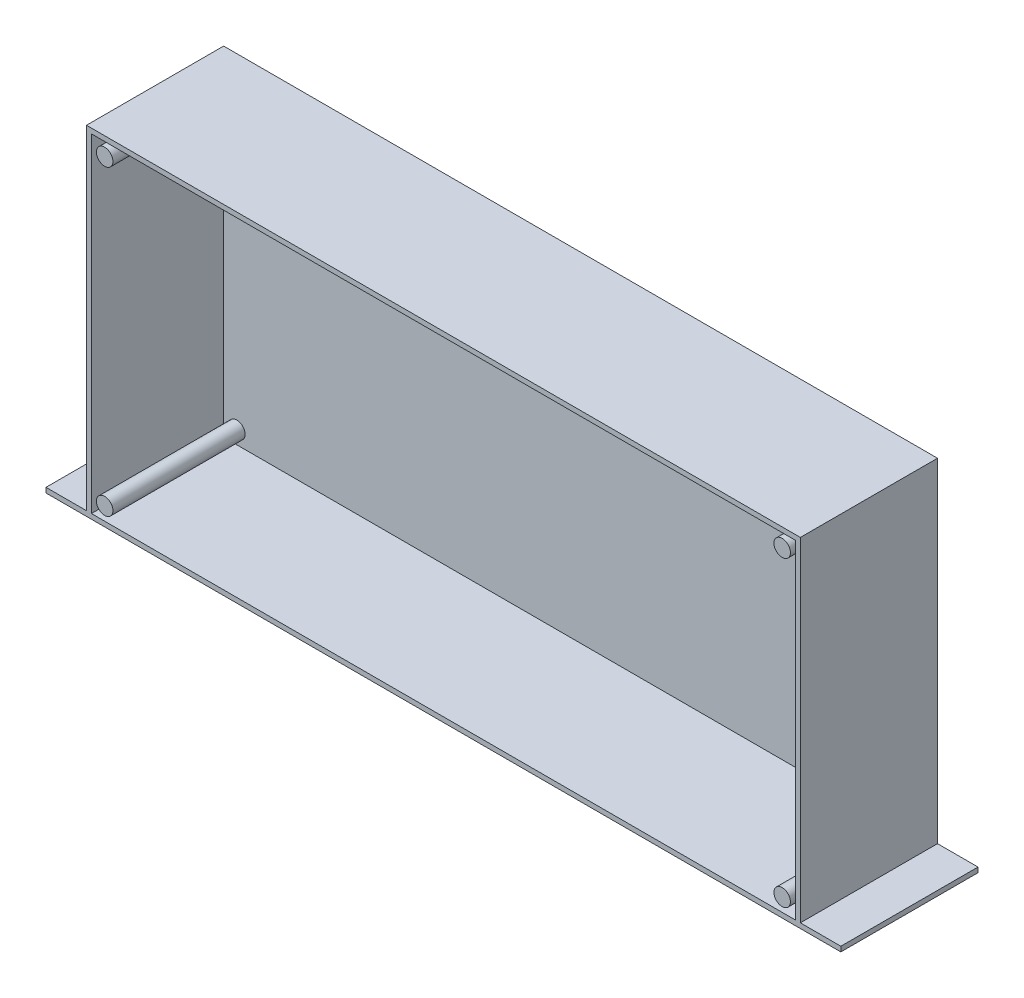
ISO-10303-21;
HEADER;
FILE_DESCRIPTION(('STEP AP214'),'2;1');
FILE_NAME('part.step','',(''),(''),'','','');
FILE_SCHEMA(('AUTOMOTIVE_DESIGN { 1 0 10303 214 1 1 1 1 }'));
ENDSEC;
DATA;
#1=APPLICATION_CONTEXT('core data for automotive mechanical design processes');
#2=APPLICATION_PROTOCOL_DEFINITION('international standard','automotive_design',2000,#1);
#3=PRODUCT_CONTEXT('',#1,'mechanical');
#4=PRODUCT('Part','Part','',(#3));
#5=PRODUCT_RELATED_PRODUCT_CATEGORY('part','',(#4));
#6=PRODUCT_DEFINITION_FORMATION('','',#4);
#7=PRODUCT_DEFINITION_CONTEXT('part definition',#1,'design');
#8=PRODUCT_DEFINITION('design','',#6,#7);
#9=PRODUCT_DEFINITION_SHAPE('','',#8);
#10=(LENGTH_UNIT() NAMED_UNIT(*) SI_UNIT(.MILLI.,.METRE.));
#11=(NAMED_UNIT(*) PLANE_ANGLE_UNIT() SI_UNIT($,.RADIAN.));
#12=(NAMED_UNIT(*) SI_UNIT($,.STERADIAN.) SOLID_ANGLE_UNIT());
#13=UNCERTAINTY_MEASURE_WITH_UNIT(LENGTH_MEASURE(1.E-05),#10,'distance_accuracy_value','');
#14=(GEOMETRIC_REPRESENTATION_CONTEXT(3) GLOBAL_UNCERTAINTY_ASSIGNED_CONTEXT((#13)) GLOBAL_UNIT_ASSIGNED_CONTEXT((#10,
#11,#12)) REPRESENTATION_CONTEXT('',''));
#15=CARTESIAN_POINT('',(0.,0.,0.));
#16=DIRECTION('',(0.,0.,1.));
#17=DIRECTION('',(1.,0.,0.));
#18=AXIS2_PLACEMENT_3D('',#15,#16,#17);
#19=CARTESIAN_POINT('',(456.5,0.,3.));
#20=DIRECTION('',(-1.,0.,0.));
#21=DIRECTION('',(0.,0.,1.));
#22=AXIS2_PLACEMENT_3D('',#19,#20,#21);
#23=PLANE('',#22);
#24=DIRECTION('',(0.,1.,0.));
#25=VECTOR('',#24,1.);
#26=CARTESIAN_POINT('',(456.5,0.,0.));
#27=LINE('',#26,#25);
#28=CARTESIAN_POINT('',(456.5,0.,0.));
#29=VERTEX_POINT('',#28);
#30=CARTESIAN_POINT('',(456.5,2.99999999999994,0.));
#31=VERTEX_POINT('',#30);
#32=EDGE_CURVE('E187',#29,#31,#27,.T.);
#33=ORIENTED_EDGE('',*,*,#32,.T.);
#34=DIRECTION('',(0.,0.,-1.));
#35=VECTOR('',#34,1.);
#36=CARTESIAN_POINT('',(456.5,2.99999999999994,3.));
#37=LINE('',#36,#35);
#38=CARTESIAN_POINT('',(456.5,2.99999999999994,83.));
#39=VERTEX_POINT('',#38);
#40=EDGE_CURVE('E45',#39,#31,#37,.T.);
#41=ORIENTED_EDGE('',*,*,#40,.F.);
#42=DIRECTION('',(0.,1.,0.));
#43=VECTOR('',#42,1.);
#44=CARTESIAN_POINT('',(456.5,0.,83.));
#45=LINE('',#44,#43);
#46=CARTESIAN_POINT('',(456.5,0.,83.));
#47=VERTEX_POINT('',#46);
#48=EDGE_CURVE('E166',#47,#39,#45,.T.);
#49=ORIENTED_EDGE('',*,*,#48,.F.);
#50=DIRECTION('',(0.,0.,-1.));
#51=VECTOR('',#50,1.);
#52=CARTESIAN_POINT('',(456.5,0.,3.));
#53=LINE('',#52,#51);
#54=EDGE_CURVE('E11',#47,#29,#53,.T.);
#55=ORIENTED_EDGE('',*,*,#54,.T.);
#56=EDGE_LOOP('',(#33,#41,#49,#55));
#57=FACE_BOUND('',#56,.T.);
#58=ADVANCED_FACE('F38',(#57),#23,.F.);
#59=CARTESIAN_POINT('',(456.5,2.99999999999994,3.));
#60=DIRECTION('',(0.,-1.,0.));
#61=DIRECTION('',(0.,0.,-1.));
#62=AXIS2_PLACEMENT_3D('',#59,#60,#61);
#63=PLANE('',#62);
#64=DIRECTION('',(-1.,0.,0.));
#65=VECTOR('',#64,1.);
#66=CARTESIAN_POINT('',(456.5,2.99999999999994,0.));
#67=LINE('',#66,#65);
#68=CARTESIAN_POINT('',(432.,2.99999999999994,0.));
#69=VERTEX_POINT('',#68);
#70=EDGE_CURVE('E189',#31,#69,#67,.T.);
#71=ORIENTED_EDGE('',*,*,#70,.T.);
#72=DIRECTION('',(0.,0.,-1.));
#73=VECTOR('',#72,1.);
#74=CARTESIAN_POINT('',(432.,2.99999999999994,3.));
#75=LINE('',#74,#73);
#76=CARTESIAN_POINT('',(432.,2.99999999999994,83.));
#77=VERTEX_POINT('',#76);
#78=EDGE_CURVE('E218',#77,#69,#75,.T.);
#79=ORIENTED_EDGE('',*,*,#78,.F.);
#80=DIRECTION('',(-1.,0.,0.));
#81=VECTOR('',#80,1.);
#82=CARTESIAN_POINT('',(456.5,2.99999999999994,83.));
#83=LINE('',#82,#81);
#84=EDGE_CURVE('E169',#39,#77,#83,.T.);
#85=ORIENTED_EDGE('',*,*,#84,.F.);
#86=ORIENTED_EDGE('',*,*,#40,.T.);
#87=EDGE_LOOP('',(#71,#79,#85,#86));
#88=FACE_BOUND('',#87,.T.);
#89=ADVANCED_FACE('F224',(#88),#63,.F.);
#90=CARTESIAN_POINT('',(432.,2.99999999999994,3.));
#91=DIRECTION('',(-1.,0.,0.));
#92=DIRECTION('',(0.,-1.,0.));
#93=AXIS2_PLACEMENT_3D('',#90,#91,#92);
#94=PLANE('',#93);
#95=DIRECTION('',(0.,1.,0.));
#96=VECTOR('',#95,1.);
#97=CARTESIAN_POINT('',(432.,2.99999999999994,0.));
#98=LINE('',#97,#96);
#99=CARTESIAN_POINT('',(432.,205.,0.));
#100=VERTEX_POINT('',#99);
#101=EDGE_CURVE('E191',#69,#100,#98,.T.);
#102=ORIENTED_EDGE('',*,*,#101,.T.);
#103=DIRECTION('',(0.,0.,-1.));
#104=VECTOR('',#103,1.);
#105=CARTESIAN_POINT('',(432.,205.,3.));
#106=LINE('',#105,#104);
#107=CARTESIAN_POINT('',(432.,205.,83.));
#108=VERTEX_POINT('',#107);
#109=EDGE_CURVE('E215',#108,#100,#106,.T.);
#110=ORIENTED_EDGE('',*,*,#109,.F.);
#111=DIRECTION('',(0.,1.,0.));
#112=VECTOR('',#111,1.);
#113=CARTESIAN_POINT('',(432.,2.99999999999994,83.));
#114=LINE('',#113,#112);
#115=EDGE_CURVE('E172',#77,#108,#114,.T.);
#116=ORIENTED_EDGE('',*,*,#115,.F.);
#117=ORIENTED_EDGE('',*,*,#78,.T.);
#118=EDGE_LOOP('',(#102,#110,#116,#117));
#119=FACE_BOUND('',#118,.T.);
#120=ADVANCED_FACE('F235',(#119),#94,.F.);
#121=CARTESIAN_POINT('',(0.,205.,3.));
#122=DIRECTION('',(0.,-1.,0.));
#123=DIRECTION('',(0.,0.,-1.));
#124=AXIS2_PLACEMENT_3D('',#121,#122,#123);
#125=PLANE('',#124);
#126=DIRECTION('',(-1.,0.,0.));
#127=VECTOR('',#126,1.);
#128=CARTESIAN_POINT('',(0.,205.,0.));
#129=LINE('',#128,#127);
#130=CARTESIAN_POINT('',(0.,205.,0.));
#131=VERTEX_POINT('',#130);
#132=EDGE_CURVE('E193',#100,#131,#129,.T.);
#133=ORIENTED_EDGE('',*,*,#132,.T.);
#134=DIRECTION('',(0.,0.,-1.));
#135=VECTOR('',#134,1.);
#136=CARTESIAN_POINT('',(0.,205.,3.));
#137=LINE('',#136,#135);
#138=CARTESIAN_POINT('',(0.,205.,83.));
#139=VERTEX_POINT('',#138);
#140=EDGE_CURVE('E212',#139,#131,#137,.T.);
#141=ORIENTED_EDGE('',*,*,#140,.F.);
#142=DIRECTION('',(-1.,0.,0.));
#143=VECTOR('',#142,1.);
#144=CARTESIAN_POINT('',(432.,205.,83.));
#145=LINE('',#144,#143);
#146=EDGE_CURVE('E175',#108,#139,#145,.T.);
#147=ORIENTED_EDGE('',*,*,#146,.F.);
#148=ORIENTED_EDGE('',*,*,#109,.T.);
#149=EDGE_LOOP('',(#133,#141,#147,#148));
#150=FACE_BOUND('',#149,.T.);
#151=ADVANCED_FACE('F239',(#150),#125,.F.);
#152=CARTESIAN_POINT('',(0.,3.,3.));
#153=DIRECTION('',(1.,0.,0.));
#154=DIRECTION('',(0.,0.,-1.));
#155=AXIS2_PLACEMENT_3D('',#152,#153,#154);
#156=PLANE('',#155);
#157=DIRECTION('',(0.,-1.,0.));
#158=VECTOR('',#157,1.);
#159=CARTESIAN_POINT('',(0.,3.,0.));
#160=LINE('',#159,#158);
#161=CARTESIAN_POINT('',(0.,3.,0.));
#162=VERTEX_POINT('',#161);
#163=EDGE_CURVE('E195',#131,#162,#160,.T.);
#164=ORIENTED_EDGE('',*,*,#163,.T.);
#165=DIRECTION('',(0.,0.,-1.));
#166=VECTOR('',#165,1.);
#167=CARTESIAN_POINT('',(0.,3.,3.));
#168=LINE('',#167,#166);
#169=CARTESIAN_POINT('',(0.,3.,83.));
#170=VERTEX_POINT('',#169);
#171=EDGE_CURVE('E209',#170,#162,#168,.T.);
#172=ORIENTED_EDGE('',*,*,#171,.F.);
#173=DIRECTION('',(0.,-1.,0.));
#174=VECTOR('',#173,1.);
#175=CARTESIAN_POINT('',(0.,205.,83.));
#176=LINE('',#175,#174);
#177=EDGE_CURVE('E178',#139,#170,#176,.T.);
#178=ORIENTED_EDGE('',*,*,#177,.F.);
#179=ORIENTED_EDGE('',*,*,#140,.T.);
#180=EDGE_LOOP('',(#164,#172,#178,#179));
#181=FACE_BOUND('',#180,.T.);
#182=ADVANCED_FACE('F244',(#181),#156,.F.);
#183=CARTESIAN_POINT('',(-24.5,3.,3.));
#184=DIRECTION('',(0.,-1.,0.));
#185=DIRECTION('',(0.,0.,-1.));
#186=AXIS2_PLACEMENT_3D('',#183,#184,#185);
#187=PLANE('',#186);
#188=DIRECTION('',(-1.,0.,0.));
#189=VECTOR('',#188,1.);
#190=CARTESIAN_POINT('',(-24.5,3.,0.));
#191=LINE('',#190,#189);
#192=CARTESIAN_POINT('',(-24.5,3.,0.));
#193=VERTEX_POINT('',#192);
#194=EDGE_CURVE('E197',#162,#193,#191,.T.);
#195=ORIENTED_EDGE('',*,*,#194,.T.);
#196=DIRECTION('',(0.,0.,-1.));
#197=VECTOR('',#196,1.);
#198=CARTESIAN_POINT('',(-24.5,3.,3.));
#199=LINE('',#198,#197);
#200=CARTESIAN_POINT('',(-24.5,3.,83.));
#201=VERTEX_POINT('',#200);
#202=EDGE_CURVE('E206',#201,#193,#199,.T.);
#203=ORIENTED_EDGE('',*,*,#202,.F.);
#204=DIRECTION('',(-1.,0.,0.));
#205=VECTOR('',#204,1.);
#206=CARTESIAN_POINT('',(0.,3.,83.));
#207=LINE('',#206,#205);
#208=EDGE_CURVE('E181',#170,#201,#207,.T.);
#209=ORIENTED_EDGE('',*,*,#208,.F.);
#210=ORIENTED_EDGE('',*,*,#171,.T.);
#211=EDGE_LOOP('',(#195,#203,#209,#210));
#212=FACE_BOUND('',#211,.T.);
#213=ADVANCED_FACE('F247',(#212),#187,.F.);
#214=CARTESIAN_POINT('',(-24.5,0.,3.));
#215=DIRECTION('',(1.,0.,0.));
#216=DIRECTION('',(0.,1.,0.));
#217=AXIS2_PLACEMENT_3D('',#214,#215,#216);
#218=PLANE('',#217);
#219=DIRECTION('',(0.,-1.,0.));
#220=VECTOR('',#219,1.);
#221=CARTESIAN_POINT('',(-24.5,0.,0.));
#222=LINE('',#221,#220);
#223=CARTESIAN_POINT('',(-24.5,0.,0.));
#224=VERTEX_POINT('',#223);
#225=EDGE_CURVE('E199',#193,#224,#222,.T.);
#226=ORIENTED_EDGE('',*,*,#225,.T.);
#227=DIRECTION('',(0.,0.,-1.));
#228=VECTOR('',#227,1.);
#229=CARTESIAN_POINT('',(-24.5,0.,3.));
#230=LINE('',#229,#228);
#231=CARTESIAN_POINT('',(-24.5,0.,83.));
#232=VERTEX_POINT('',#231);
#233=EDGE_CURVE('E203',#232,#224,#230,.T.);
#234=ORIENTED_EDGE('',*,*,#233,.F.);
#235=DIRECTION('',(0.,-1.,0.));
#236=VECTOR('',#235,1.);
#237=CARTESIAN_POINT('',(-24.5,3.,83.));
#238=LINE('',#237,#236);
#239=EDGE_CURVE('E184',#201,#232,#238,.T.);
#240=ORIENTED_EDGE('',*,*,#239,.F.);
#241=ORIENTED_EDGE('',*,*,#202,.T.);
#242=EDGE_LOOP('',(#226,#234,#240,#241));
#243=FACE_BOUND('',#242,.T.);
#244=ADVANCED_FACE('F250',(#243),#218,.F.);
#245=CARTESIAN_POINT('',(0.,0.,3.));
#246=DIRECTION('',(0.,1.,0.));
#247=DIRECTION('',(-1.,0.,0.));
#248=AXIS2_PLACEMENT_3D('',#245,#246,#247);
#249=PLANE('',#248);
#250=DIRECTION('',(1.,0.,0.));
#251=VECTOR('',#250,1.);
#252=CARTESIAN_POINT('',(0.,0.,0.));
#253=LINE('',#252,#251);
#254=EDGE_CURVE('E201',#224,#29,#253,.T.);
#255=ORIENTED_EDGE('',*,*,#254,.T.);
#256=ORIENTED_EDGE('',*,*,#54,.F.);
#257=DIRECTION('',(1.,0.,0.));
#258=VECTOR('',#257,1.);
#259=CARTESIAN_POINT('',(-24.5,0.,83.));
#260=LINE('',#259,#258);
#261=EDGE_CURVE('E140',#232,#47,#260,.T.);
#262=ORIENTED_EDGE('',*,*,#261,.F.);
#263=ORIENTED_EDGE('',*,*,#233,.T.);
#264=EDGE_LOOP('',(#255,#256,#262,#263));
#265=FACE_BOUND('',#264,.T.);
#266=ADVANCED_FACE('F254',(#265),#249,.F.);
#267=CARTESIAN_POINT('',(0.,0.,0.));
#268=DIRECTION('',(0.,0.,1.));
#269=DIRECTION('',(1.,0.,0.));
#270=AXIS2_PLACEMENT_3D('',#267,#268,#269);
#271=PLANE('',#270);
#272=ORIENTED_EDGE('',*,*,#32,.F.);
#273=ORIENTED_EDGE('',*,*,#254,.F.);
#274=ORIENTED_EDGE('',*,*,#225,.F.);
#275=ORIENTED_EDGE('',*,*,#194,.F.);
#276=ORIENTED_EDGE('',*,*,#163,.F.);
#277=ORIENTED_EDGE('',*,*,#132,.F.);
#278=ORIENTED_EDGE('',*,*,#101,.F.);
#279=ORIENTED_EDGE('',*,*,#70,.F.);
#280=EDGE_LOOP('',(#272,#273,#274,#275,#276,#277,#278,#279));
#281=FACE_BOUND('',#280,.T.);
#282=ADVANCED_FACE('F230',(#281),#271,.F.);
#283=CARTESIAN_POINT('',(0.,0.,83.));
#284=DIRECTION('',(0.,0.,1.));
#285=DIRECTION('',(1.,0.,0.));
#286=AXIS2_PLACEMENT_3D('',#283,#284,#285);
#287=PLANE('',#286);
#288=ORIENTED_EDGE('',*,*,#261,.T.);
#289=ORIENTED_EDGE('',*,*,#48,.T.);
#290=ORIENTED_EDGE('',*,*,#84,.T.);
#291=ORIENTED_EDGE('',*,*,#115,.T.);
#292=ORIENTED_EDGE('',*,*,#146,.T.);
#293=ORIENTED_EDGE('',*,*,#177,.T.);
#294=ORIENTED_EDGE('',*,*,#208,.T.);
#295=ORIENTED_EDGE('',*,*,#239,.T.);
#296=EDGE_LOOP('',(#288,#289,#290,#291,#292,#293,#294,#295));
#297=FACE_BOUND('',#296,.T.);
#298=DIRECTION('',(-1.,0.,0.));
#299=VECTOR('',#298,1.);
#300=CARTESIAN_POINT('',(429.,202.,83.));
#301=LINE('',#300,#299);
#302=CARTESIAN_POINT('',(429.,202.,83.));
#303=VERTEX_POINT('',#302);
#304=CARTESIAN_POINT('',(3.,202.,83.));
#305=VERTEX_POINT('',#304);
#306=EDGE_CURVE('E134',#303,#305,#301,.T.);
#307=ORIENTED_EDGE('',*,*,#306,.F.);
#308=DIRECTION('',(0.,1.,0.));
#309=VECTOR('',#308,1.);
#310=CARTESIAN_POINT('',(429.,2.99999999999994,83.));
#311=LINE('',#310,#309);
#312=CARTESIAN_POINT('',(429.,2.99999999999994,83.));
#313=VERTEX_POINT('',#312);
#314=EDGE_CURVE('E125',#313,#303,#311,.T.);
#315=ORIENTED_EDGE('',*,*,#314,.F.);
#316=DIRECTION('',(1.,0.,0.));
#317=VECTOR('',#316,1.);
#318=CARTESIAN_POINT('',(3.,3.,83.));
#319=LINE('',#318,#317);
#320=CARTESIAN_POINT('',(3.,3.,83.));
#321=VERTEX_POINT('',#320);
#322=EDGE_CURVE('E148',#321,#313,#319,.T.);
#323=ORIENTED_EDGE('',*,*,#322,.F.);
#324=DIRECTION('',(0.,-1.,0.));
#325=VECTOR('',#324,1.);
#326=CARTESIAN_POINT('',(3.,202.,83.));
#327=LINE('',#326,#325);
#328=EDGE_CURVE('E146',#305,#321,#327,.T.);
#329=ORIENTED_EDGE('',*,*,#328,.F.);
#330=EDGE_LOOP('',(#307,#315,#323,#329));
#331=FACE_BOUND('',#330,.T.);
#332=ADVANCED_FACE('F144',(#297,#331),#287,.T.);
#333=CARTESIAN_POINT('',(429.,2.99999999999994,83.));
#334=DIRECTION('',(-1.,0.,0.));
#335=DIRECTION('',(0.,-1.,0.));
#336=AXIS2_PLACEMENT_3D('',#333,#334,#335);
#337=PLANE('',#336);
#338=DIRECTION('',(0.,1.,0.));
#339=VECTOR('',#338,1.);
#340=CARTESIAN_POINT('',(429.,2.99999999999994,3.));
#341=LINE('',#340,#339);
#342=CARTESIAN_POINT('',(429.,2.99999999999994,3.));
#343=VERTEX_POINT('',#342);
#344=CARTESIAN_POINT('',(429.,202.,3.));
#345=VERTEX_POINT('',#344);
#346=EDGE_CURVE('E52',#343,#345,#341,.T.);
#347=ORIENTED_EDGE('',*,*,#346,.F.);
#348=DIRECTION('',(0.,0.,-1.));
#349=VECTOR('',#348,1.);
#350=CARTESIAN_POINT('',(429.,2.99999999999994,83.));
#351=LINE('',#350,#349);
#352=EDGE_CURVE('E130',#313,#343,#351,.T.);
#353=ORIENTED_EDGE('',*,*,#352,.F.);
#354=ORIENTED_EDGE('',*,*,#314,.T.);
#355=DIRECTION('',(0.,0.,-1.));
#356=VECTOR('',#355,1.);
#357=CARTESIAN_POINT('',(429.,202.,83.));
#358=LINE('',#357,#356);
#359=EDGE_CURVE('E128',#303,#345,#358,.T.);
#360=ORIENTED_EDGE('',*,*,#359,.T.);
#361=EDGE_LOOP('',(#347,#353,#354,#360));
#362=FACE_BOUND('',#361,.T.);
#363=ADVANCED_FACE('F127',(#362),#337,.T.);
#364=CARTESIAN_POINT('',(429.,202.,83.));
#365=DIRECTION('',(0.,-1.,0.));
#366=DIRECTION('',(0.,0.,-1.));
#367=AXIS2_PLACEMENT_3D('',#364,#365,#366);
#368=PLANE('',#367);
#369=DIRECTION('',(-1.,0.,0.));
#370=VECTOR('',#369,1.);
#371=CARTESIAN_POINT('',(429.,202.,3.));
#372=LINE('',#371,#370);
#373=CARTESIAN_POINT('',(3.,202.,3.));
#374=VERTEX_POINT('',#373);
#375=EDGE_CURVE('E56',#345,#374,#372,.T.);
#376=ORIENTED_EDGE('',*,*,#375,.F.);
#377=ORIENTED_EDGE('',*,*,#359,.F.);
#378=ORIENTED_EDGE('',*,*,#306,.T.);
#379=DIRECTION('',(0.,0.,-1.));
#380=VECTOR('',#379,1.);
#381=CARTESIAN_POINT('',(3.,202.,83.));
#382=LINE('',#381,#380);
#383=EDGE_CURVE('E141',#305,#374,#382,.T.);
#384=ORIENTED_EDGE('',*,*,#383,.T.);
#385=EDGE_LOOP('',(#376,#377,#378,#384));
#386=FACE_BOUND('',#385,.T.);
#387=ADVANCED_FACE('F138',(#386),#368,.T.);
#388=CARTESIAN_POINT('',(3.,202.,83.));
#389=DIRECTION('',(1.,0.,0.));
#390=DIRECTION('',(0.,1.,0.));
#391=AXIS2_PLACEMENT_3D('',#388,#389,#390);
#392=PLANE('',#391);
#393=DIRECTION('',(0.,-1.,0.));
#394=VECTOR('',#393,1.);
#395=CARTESIAN_POINT('',(3.,202.,3.));
#396=LINE('',#395,#394);
#397=CARTESIAN_POINT('',(3.,3.,3.));
#398=VERTEX_POINT('',#397);
#399=EDGE_CURVE('E156',#374,#398,#396,.T.);
#400=ORIENTED_EDGE('',*,*,#399,.F.);
#401=ORIENTED_EDGE('',*,*,#383,.F.);
#402=ORIENTED_EDGE('',*,*,#328,.T.);
#403=DIRECTION('',(0.,0.,-1.));
#404=VECTOR('',#403,1.);
#405=CARTESIAN_POINT('',(3.,3.,83.));
#406=LINE('',#405,#404);
#407=EDGE_CURVE('E160',#321,#398,#406,.T.);
#408=ORIENTED_EDGE('',*,*,#407,.T.);
#409=EDGE_LOOP('',(#400,#401,#402,#408));
#410=FACE_BOUND('',#409,.T.);
#411=ADVANCED_FACE('F288',(#410),#392,.T.);
#412=CARTESIAN_POINT('',(3.,3.,83.));
#413=DIRECTION('',(0.,1.,0.));
#414=DIRECTION('',(-1.,0.,0.));
#415=AXIS2_PLACEMENT_3D('',#412,#413,#414);
#416=PLANE('',#415);
#417=DIRECTION('',(1.,0.,0.));
#418=VECTOR('',#417,1.);
#419=CARTESIAN_POINT('',(3.,3.,3.));
#420=LINE('',#419,#418);
#421=EDGE_CURVE('E135',#398,#343,#420,.T.);
#422=ORIENTED_EDGE('',*,*,#421,.F.);
#423=ORIENTED_EDGE('',*,*,#407,.F.);
#424=ORIENTED_EDGE('',*,*,#322,.T.);
#425=ORIENTED_EDGE('',*,*,#352,.T.);
#426=EDGE_LOOP('',(#422,#423,#424,#425));
#427=FACE_BOUND('',#426,.T.);
#428=ADVANCED_FACE('F280',(#427),#416,.T.);
#429=CARTESIAN_POINT('',(0.,0.,3.));
#430=DIRECTION('',(0.,0.,1.));
#431=DIRECTION('',(1.,0.,0.));
#432=AXIS2_PLACEMENT_3D('',#429,#430,#431);
#433=PLANE('',#432);
#434=CARTESIAN_POINT('',(11.,11.,3.));
#435=DIRECTION('',(0.,0.,1.));
#436=DIRECTION('',(1.,0.,0.));
#437=AXIS2_PLACEMENT_3D('',#434,#435,#436);
#438=CIRCLE('',#437,5.);
#439=CARTESIAN_POINT('',(16.,11.,3.));
#440=VERTEX_POINT('',#439);
#441=EDGE_CURVE('E331',#440,#440,#438,.T.);
#442=ORIENTED_EDGE('',*,*,#441,.F.);
#443=EDGE_LOOP('',(#442));
#444=FACE_BOUND('',#443,.T.);
#445=CARTESIAN_POINT('',(421.,11.,3.));
#446=DIRECTION('',(0.,0.,1.));
#447=DIRECTION('',(1.,0.,0.));
#448=AXIS2_PLACEMENT_3D('',#445,#446,#447);
#449=CIRCLE('',#448,4.99999999999999);
#450=CARTESIAN_POINT('',(426.,11.,3.));
#451=VERTEX_POINT('',#450);
#452=EDGE_CURVE('E330',#451,#451,#449,.T.);
#453=ORIENTED_EDGE('',*,*,#452,.F.);
#454=EDGE_LOOP('',(#453));
#455=FACE_BOUND('',#454,.T.);
#456=CARTESIAN_POINT('',(421.,194.,3.));
#457=DIRECTION('',(0.,0.,1.));
#458=DIRECTION('',(1.,0.,0.));
#459=AXIS2_PLACEMENT_3D('',#456,#457,#458);
#460=CIRCLE('',#459,4.99999999999999);
#461=CARTESIAN_POINT('',(426.,194.,3.));
#462=VERTEX_POINT('',#461);
#463=EDGE_CURVE('E340',#462,#462,#460,.T.);
#464=ORIENTED_EDGE('',*,*,#463,.F.);
#465=EDGE_LOOP('',(#464));
#466=FACE_BOUND('',#465,.T.);
#467=CARTESIAN_POINT('',(11.,194.,3.));
#468=DIRECTION('',(0.,0.,1.));
#469=DIRECTION('',(1.,0.,0.));
#470=AXIS2_PLACEMENT_3D('',#467,#468,#469);
#471=CIRCLE('',#470,5.);
#472=CARTESIAN_POINT('',(16.,194.,3.));
#473=VERTEX_POINT('',#472);
#474=EDGE_CURVE('E345',#473,#473,#471,.T.);
#475=ORIENTED_EDGE('',*,*,#474,.F.);
#476=EDGE_LOOP('',(#475));
#477=FACE_BOUND('',#476,.T.);
#478=ORIENTED_EDGE('',*,*,#346,.T.);
#479=ORIENTED_EDGE('',*,*,#375,.T.);
#480=ORIENTED_EDGE('',*,*,#399,.T.);
#481=ORIENTED_EDGE('',*,*,#421,.T.);
#482=EDGE_LOOP('',(#478,#479,#480,#481));
#483=FACE_BOUND('',#482,.T.);
#484=ADVANCED_FACE('F276',(#444,#455,#466,#477,#483),#433,.T.);
#485=CARTESIAN_POINT('',(11.,194.,83.));
#486=DIRECTION('',(0.,0.,-1.));
#487=DIRECTION('',(-1.,0.,0.));
#488=AXIS2_PLACEMENT_3D('',#485,#486,#487);
#489=CYLINDRICAL_SURFACE('',#488,5.);
#490=CARTESIAN_POINT('',(11.,194.,83.));
#491=DIRECTION('',(0.,0.,1.));
#492=DIRECTION('',(1.,0.,0.));
#493=AXIS2_PLACEMENT_3D('',#490,#491,#492);
#494=CIRCLE('',#493,5.);
#495=CARTESIAN_POINT('',(16.,194.,83.));
#496=VERTEX_POINT('',#495);
#497=EDGE_CURVE('E154',#496,#496,#494,.T.);
#498=ORIENTED_EDGE('',*,*,#497,.F.);
#499=EDGE_LOOP('',(#498));
#500=FACE_BOUND('',#499,.T.);
#501=ORIENTED_EDGE('',*,*,#474,.T.);
#502=EDGE_LOOP('',(#501));
#503=FACE_BOUND('',#502,.T.);
#504=ADVANCED_FACE('F279',(#500,#503),#489,.T.);
#505=CARTESIAN_POINT('',(11.,194.,83.));
#506=DIRECTION('',(0.,0.,1.));
#507=DIRECTION('',(1.,0.,0.));
#508=AXIS2_PLACEMENT_3D('',#505,#506,#507);
#509=PLANE('',#508);
#510=ORIENTED_EDGE('',*,*,#497,.T.);
#511=EDGE_LOOP('',(#510));
#512=FACE_BOUND('',#511,.T.);
#513=ADVANCED_FACE('F297',(#512),#509,.T.);
#514=CARTESIAN_POINT('',(421.,194.,83.));
#515=DIRECTION('',(0.,0.,-1.));
#516=DIRECTION('',(-1.,0.,0.));
#517=AXIS2_PLACEMENT_3D('',#514,#515,#516);
#518=CYLINDRICAL_SURFACE('',#517,4.99999999999999);
#519=CARTESIAN_POINT('',(421.,194.,83.));
#520=DIRECTION('',(0.,0.,1.));
#521=DIRECTION('',(1.,0.,0.));
#522=AXIS2_PLACEMENT_3D('',#519,#520,#521);
#523=CIRCLE('',#522,4.99999999999999);
#524=CARTESIAN_POINT('',(426.,194.,83.));
#525=VERTEX_POINT('',#524);
#526=EDGE_CURVE('E342',#525,#525,#523,.T.);
#527=ORIENTED_EDGE('',*,*,#526,.F.);
#528=EDGE_LOOP('',(#527));
#529=FACE_BOUND('',#528,.T.);
#530=ORIENTED_EDGE('',*,*,#463,.T.);
#531=EDGE_LOOP('',(#530));
#532=FACE_BOUND('',#531,.T.);
#533=ADVANCED_FACE('F301',(#529,#532),#518,.T.);
#534=CARTESIAN_POINT('',(421.,194.,83.));
#535=DIRECTION('',(0.,0.,1.));
#536=DIRECTION('',(1.,0.,0.));
#537=AXIS2_PLACEMENT_3D('',#534,#535,#536);
#538=PLANE('',#537);
#539=ORIENTED_EDGE('',*,*,#526,.T.);
#540=EDGE_LOOP('',(#539));
#541=FACE_BOUND('',#540,.T.);
#542=ADVANCED_FACE('F305',(#541),#538,.T.);
#543=CARTESIAN_POINT('',(421.,11.,83.));
#544=DIRECTION('',(0.,0.,-1.));
#545=DIRECTION('',(-1.,0.,0.));
#546=AXIS2_PLACEMENT_3D('',#543,#544,#545);
#547=CYLINDRICAL_SURFACE('',#546,4.99999999999999);
#548=CARTESIAN_POINT('',(421.,11.,83.));
#549=DIRECTION('',(0.,0.,1.));
#550=DIRECTION('',(1.,0.,0.));
#551=AXIS2_PLACEMENT_3D('',#548,#549,#550);
#552=CIRCLE('',#551,4.99999999999999);
#553=CARTESIAN_POINT('',(426.,11.,83.));
#554=VERTEX_POINT('',#553);
#555=EDGE_CURVE('E334',#554,#554,#552,.T.);
#556=ORIENTED_EDGE('',*,*,#555,.F.);
#557=EDGE_LOOP('',(#556));
#558=FACE_BOUND('',#557,.T.);
#559=ORIENTED_EDGE('',*,*,#452,.T.);
#560=EDGE_LOOP('',(#559));
#561=FACE_BOUND('',#560,.T.);
#562=ADVANCED_FACE('F309',(#558,#561),#547,.T.);
#563=CARTESIAN_POINT('',(421.,11.,83.));
#564=DIRECTION('',(0.,0.,1.));
#565=DIRECTION('',(1.,0.,0.));
#566=AXIS2_PLACEMENT_3D('',#563,#564,#565);
#567=PLANE('',#566);
#568=ORIENTED_EDGE('',*,*,#555,.T.);
#569=EDGE_LOOP('',(#568));
#570=FACE_BOUND('',#569,.T.);
#571=ADVANCED_FACE('F313',(#570),#567,.T.);
#572=CARTESIAN_POINT('',(11.,11.,83.));
#573=DIRECTION('',(0.,0.,-1.));
#574=DIRECTION('',(-1.,0.,0.));
#575=AXIS2_PLACEMENT_3D('',#572,#573,#574);
#576=CYLINDRICAL_SURFACE('',#575,5.);
#577=CARTESIAN_POINT('',(11.,11.,83.));
#578=DIRECTION('',(0.,0.,1.));
#579=DIRECTION('',(1.,0.,0.));
#580=AXIS2_PLACEMENT_3D('',#577,#578,#579);
#581=CIRCLE('',#580,5.);
#582=CARTESIAN_POINT('',(16.,11.,83.));
#583=VERTEX_POINT('',#582);
#584=EDGE_CURVE('E329',#583,#583,#581,.T.);
#585=ORIENTED_EDGE('',*,*,#584,.F.);
#586=EDGE_LOOP('',(#585));
#587=FACE_BOUND('',#586,.T.);
#588=ORIENTED_EDGE('',*,*,#441,.T.);
#589=EDGE_LOOP('',(#588));
#590=FACE_BOUND('',#589,.T.);
#591=ADVANCED_FACE('F317',(#587,#590),#576,.T.);
#592=CARTESIAN_POINT('',(11.,11.,83.));
#593=DIRECTION('',(0.,0.,1.));
#594=DIRECTION('',(1.,0.,0.));
#595=AXIS2_PLACEMENT_3D('',#592,#593,#594);
#596=PLANE('',#595);
#597=ORIENTED_EDGE('',*,*,#584,.T.);
#598=EDGE_LOOP('',(#597));
#599=FACE_BOUND('',#598,.T.);
#600=ADVANCED_FACE('F321',(#599),#596,.T.);
#601=CLOSED_SHELL('',(#58,#89,#120,#151,#182,#213,#244,#266,#282,#332,#363,#387,#411,#428,#484,
#504,#513,#533,#542,#562,#571,#591,#600));
#602=MANIFOLD_SOLID_BREP('B2',#601);
#603=ADVANCED_BREP_SHAPE_REPRESENTATION('',(#18,#602),#14);
#604=SHAPE_DEFINITION_REPRESENTATION(#9,#603);
ENDSEC;
END-ISO-10303-21;
